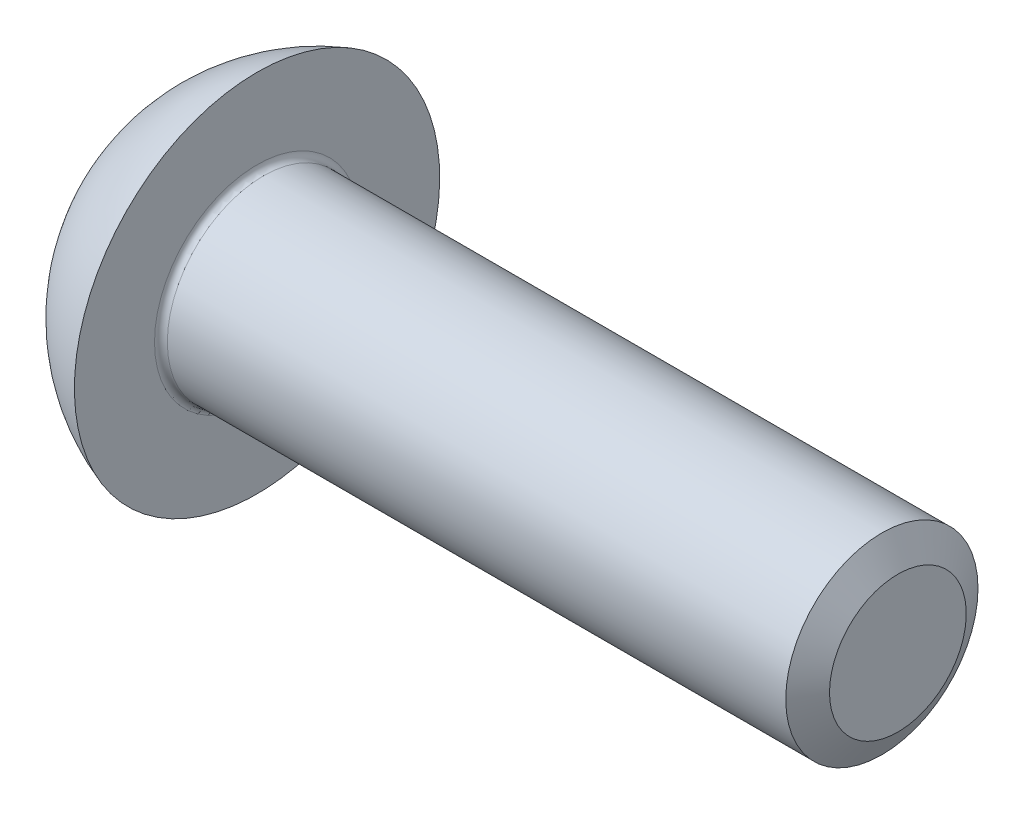
ISO-10303-21;
HEADER;
FILE_DESCRIPTION(('STEP AP214'),'2;1');
FILE_NAME('part.step','',(''),(''),'','','');
FILE_SCHEMA(('AUTOMOTIVE_DESIGN { 1 0 10303 214 1 1 1 1 }'));
ENDSEC;
DATA;
#1=APPLICATION_CONTEXT('core data for automotive mechanical design processes');
#2=APPLICATION_PROTOCOL_DEFINITION('international standard','automotive_design',2000,#1);
#3=PRODUCT_CONTEXT('',#1,'mechanical');
#4=PRODUCT('Part','Part','',(#3));
#5=PRODUCT_RELATED_PRODUCT_CATEGORY('part','',(#4));
#6=PRODUCT_DEFINITION_FORMATION('','',#4);
#7=PRODUCT_DEFINITION_CONTEXT('part definition',#1,'design');
#8=PRODUCT_DEFINITION('design','',#6,#7);
#9=PRODUCT_DEFINITION_SHAPE('','',#8);
#10=(LENGTH_UNIT() NAMED_UNIT(*) SI_UNIT(.MILLI.,.METRE.));
#11=(NAMED_UNIT(*) PLANE_ANGLE_UNIT() SI_UNIT($,.RADIAN.));
#12=(NAMED_UNIT(*) SI_UNIT($,.STERADIAN.) SOLID_ANGLE_UNIT());
#13=UNCERTAINTY_MEASURE_WITH_UNIT(LENGTH_MEASURE(1.E-05),#10,'distance_accuracy_value','');
#14=(GEOMETRIC_REPRESENTATION_CONTEXT(3) GLOBAL_UNCERTAINTY_ASSIGNED_CONTEXT((#13)) GLOBAL_UNIT_ASSIGNED_CONTEXT((#10,
#11,#12)) REPRESENTATION_CONTEXT('',''));
#15=CARTESIAN_POINT('',(0.,0.,0.));
#16=DIRECTION('',(0.,0.,1.));
#17=DIRECTION('',(1.,0.,0.));
#18=AXIS2_PLACEMENT_3D('',#15,#16,#17);
#19=CARTESIAN_POINT('',(-11.65,0.,0.));
#20=DIRECTION('',(-1.,0.,0.));
#21=DIRECTION('',(0.,0.,1.));
#22=AXIS2_PLACEMENT_3D('',#19,#20,#21);
#23=CYLINDRICAL_SURFACE('',#22,1.5);
#24=CARTESIAN_POINT('',(-9.9,0.,0.));
#25=DIRECTION('',(-1.,0.,0.));
#26=DIRECTION('',(0.,0.,1.));
#27=AXIS2_PLACEMENT_3D('',#24,#25,#26);
#28=CIRCLE('',#27,1.5);
#29=CARTESIAN_POINT('',(-9.9,0.,1.5));
#30=VERTEX_POINT('',#29);
#31=EDGE_CURVE('E259',#30,#30,#28,.T.);
#32=ORIENTED_EDGE('',*,*,#31,.F.);
#33=EDGE_LOOP('',(#32));
#34=FACE_BOUND('',#33,.T.);
#35=CARTESIAN_POINT('',(-0.25,0.,0.));
#36=DIRECTION('',(-1.,0.,0.));
#37=DIRECTION('',(0.,0.,1.));
#38=AXIS2_PLACEMENT_3D('',#35,#36,#37);
#39=CIRCLE('',#38,1.5);
#40=CARTESIAN_POINT('',(-0.25,0.,1.5));
#41=VERTEX_POINT('',#40);
#42=EDGE_CURVE('E446',#41,#41,#39,.T.);
#43=ORIENTED_EDGE('',*,*,#42,.T.);
#44=EDGE_LOOP('',(#43));
#45=FACE_BOUND('',#44,.T.);
#46=ADVANCED_FACE('F38',(#34,#45),#23,.T.);
#47=CARTESIAN_POINT('',(-11.65,0.,0.));
#48=DIRECTION('',(1.,0.,0.));
#49=DIRECTION('',(0.,0.,-1.));
#50=AXIS2_PLACEMENT_3D('',#47,#48,#49);
#51=PLANE('',#50);
#52=CARTESIAN_POINT('',(-11.65,0.,0.));
#53=DIRECTION('',(-1.,0.,0.));
#54=DIRECTION('',(0.,0.,1.));
#55=AXIS2_PLACEMENT_3D('',#52,#53,#54);
#56=CIRCLE('',#55,1.5);
#57=CARTESIAN_POINT('',(-11.65,1.5,0.));
#58=VERTEX_POINT('',#57);
#59=EDGE_CURVE('E251',#58,#58,#56,.T.);
#60=ORIENTED_EDGE('',*,*,#59,.T.);
#61=EDGE_LOOP('',(#60));
#62=FACE_BOUND('',#61,.T.);
#63=CARTESIAN_POINT('',(-11.65,0.,0.));
#64=DIRECTION('',(1.,0.,0.));
#65=DIRECTION('',(0.,0.,-1.));
#66=AXIS2_PLACEMENT_3D('',#63,#64,#65);
#67=CIRCLE('',#66,1.15470053837925);
#68=CARTESIAN_POINT('',(-11.65,-0.577350269189627,-1.));
#69=VERTEX_POINT('',#68);
#70=CARTESIAN_POINT('',(-11.65,-1.15470053837925,0.));
#71=VERTEX_POINT('',#70);
#72=EDGE_CURVE('E11',#69,#71,#67,.F.);
#73=ORIENTED_EDGE('',*,*,#72,.F.);
#74=CARTESIAN_POINT('',(-11.65,0.577350269189628,-1.));
#75=VERTEX_POINT('',#74);
#76=EDGE_CURVE('E42',#75,#69,#67,.F.);
#77=ORIENTED_EDGE('',*,*,#76,.F.);
#78=CARTESIAN_POINT('',(-11.65,1.15470053837925,0.));
#79=VERTEX_POINT('',#78);
#80=EDGE_CURVE('E111',#79,#75,#67,.F.);
#81=ORIENTED_EDGE('',*,*,#80,.F.);
#82=CARTESIAN_POINT('',(-11.65,0.,0.));
#83=DIRECTION('',(-1.,0.,0.));
#84=DIRECTION('',(0.,0.,1.));
#85=AXIS2_PLACEMENT_3D('',#82,#83,#84);
#86=CIRCLE('',#85,1.15470053837925);
#87=CARTESIAN_POINT('',(-11.65,0.577350269189629,1.));
#88=VERTEX_POINT('',#87);
#89=EDGE_CURVE('E131',#88,#79,#86,.T.);
#90=ORIENTED_EDGE('',*,*,#89,.F.);
#91=CARTESIAN_POINT('',(-11.65,-0.577350269189633,0.999999999999999));
#92=VERTEX_POINT('',#91);
#93=EDGE_CURVE('E325',#92,#88,#67,.F.);
#94=ORIENTED_EDGE('',*,*,#93,.F.);
#95=EDGE_CURVE('E47',#71,#92,#67,.F.);
#96=ORIENTED_EDGE('',*,*,#95,.F.);
#97=EDGE_LOOP('',(#73,#77,#81,#90,#94,#96));
#98=FACE_BOUND('',#97,.T.);
#99=ADVANCED_FACE('F40',(#62,#98),#51,.F.);
#100=CARTESIAN_POINT('',(-9.04545454545454,0.,0.));
#101=DIRECTION('',(-1.,0.,0.));
#102=DIRECTION('',(0.,1.,0.));
#103=AXIS2_PLACEMENT_3D('',#100,#101,#102);
#104=SPHERICAL_SURFACE('',#103,3.00560426949281);
#105=CARTESIAN_POINT('',(-10.,0.,0.));
#106=DIRECTION('',(-1.,0.,0.));
#107=DIRECTION('',(0.,0.,1.));
#108=AXIS2_PLACEMENT_3D('',#105,#106,#107);
#109=CIRCLE('',#108,2.85);
#110=CARTESIAN_POINT('',(-10.,2.85,0.));
#111=VERTEX_POINT('',#110);
#112=EDGE_CURVE('E254',#111,#111,#109,.T.);
#113=CARTESIAN_POINT('',(-11.65,1.5,0.));
#114=CARTESIAN_POINT('',(-11.6386705331495,1.51967216925548,0.));
#115=CARTESIAN_POINT('',(-11.6271181108235,1.53921593268644,0.));
#116=CARTESIAN_POINT('',(-11.6035734644196,1.57803672196104,0.));
#117=CARTESIAN_POINT('',(-11.5915812403415,1.59731374780469,0.));
#118=CARTESIAN_POINT('',(-11.5671630996322,1.6355911359664,0.));
#119=CARTESIAN_POINT('',(-11.554737183001,1.65459149828447,0.));
#120=CARTESIAN_POINT('',(-11.5294580495481,1.69230581219272,0.));
#121=CARTESIAN_POINT('',(-11.5166048327265,1.7110197637829,0.));
#122=CARTESIAN_POINT('',(-11.4904776944242,1.74815164624668,0.));
#123=CARTESIAN_POINT('',(-11.4772037729434,1.76656957712027,0.));
#124=CARTESIAN_POINT('',(-11.4502420411911,1.80309996277641,0.));
#125=CARTESIAN_POINT('',(-11.4365542309196,1.82121241755895,0.));
#126=CARTESIAN_POINT('',(-11.4087717487848,1.85712255178676,0.));
#127=CARTESIAN_POINT('',(-11.3946770769215,1.87492023123203,0.));
#128=CARTESIAN_POINT('',(-11.366088108,1.91019167733672,0.));
#129=CARTESIAN_POINT('',(-11.3515938109419,1.92766544399614,0.));
#130=CARTESIAN_POINT('',(-11.3222130331156,1.96228009332959,0.));
#131=CARTESIAN_POINT('',(-11.3073265523475,1.97942097600363,0.));
#132=CARTESIAN_POINT('',(-11.2771690499588,2.013361057086,0.));
#133=CARTESIAN_POINT('',(-11.2618980283382,2.03016025549433,0.));
#134=CARTESIAN_POINT('',(-11.2309792845233,2.06340834318511,0.));
#135=CARTESIAN_POINT('',(-11.2153315623289,2.07985723246756,0.));
#136=CARTESIAN_POINT('',(-11.1836674510477,2.11239625689921,0.));
#137=CARTESIAN_POINT('',(-11.1676510619609,2.12848639204841,0.));
#138=CARTESIAN_POINT('',(-11.1352578398529,2.16029964739355,0.));
#139=CARTESIAN_POINT('',(-11.1188810068317,2.17602276758948,0.));
#140=CARTESIAN_POINT('',(-11.0857753048683,2.2070939206369,0.));
#141=CARTESIAN_POINT('',(-11.069046435926,2.22244195348839,0.));
#142=CARTESIAN_POINT('',(-11.0352452508718,2.25275505202893,0.));
#143=CARTESIAN_POINT('',(-11.01817293476,2.26772011771799,0.));
#144=CARTESIAN_POINT('',(-10.9836936204474,2.29725959873448,0.));
#145=CARTESIAN_POINT('',(-10.9662866222466,2.3118340140619,0.));
#146=CARTESIAN_POINT('',(-10.9311468806653,2.34058471171934,0.));
#147=CARTESIAN_POINT('',(-10.9134141372848,2.35476099404935,0.));
#148=CARTESIAN_POINT('',(-10.8776320094939,2.38270814748122,0.));
#149=CARTESIAN_POINT('',(-10.8595826250834,2.39647901858308,0.));
#150=CARTESIAN_POINT('',(-10.8231764819488,2.42360827946968,0.));
#151=CARTESIAN_POINT('',(-10.8048197232246,2.43696666925442,0.));
#152=CARTESIAN_POINT('',(-10.7678082559874,2.46326410918943,0.));
#153=CARTESIAN_POINT('',(-10.7491535474743,2.4762031593397,0.));
#154=CARTESIAN_POINT('',(-10.7115557581542,2.50165527698115,0.));
#155=CARTESIAN_POINT('',(-10.6926126773472,2.51416834447232,0.));
#156=CARTESIAN_POINT('',(-10.6544478689872,2.53876207247436,0.));
#157=CARTESIAN_POINT('',(-10.6352261414343,2.55084273298524,0.));
#158=CARTESIAN_POINT('',(-10.5965139081898,2.57456544470666,0.));
#159=CARTESIAN_POINT('',(-10.5770234024984,2.5862074959172,0.));
#160=CARTESIAN_POINT('',(-10.5377836195783,2.60904701190566,0.));
#161=CARTESIAN_POINT('',(-10.5180343423497,2.62024447668356,0.));
#162=CARTESIAN_POINT('',(-10.4782871558097,2.6421890709225,0.));
#163=CARTESIAN_POINT('',(-10.4582892464984,2.65293620038353,0.));
#164=CARTESIAN_POINT('',(-10.4180550629064,2.67397460633529,0.));
#165=CARTESIAN_POINT('',(-10.3978187886257,2.68426588282604,0.));
#166=CARTESIAN_POINT('',(-10.3571182645539,2.70438729913089,0.));
#167=CARTESIAN_POINT('',(-10.3366540147628,2.714217438945,0.));
#168=CARTESIAN_POINT('',(-10.2955080462974,2.73341153528513,0.));
#169=CARTESIAN_POINT('',(-10.2748263276231,2.74277549181114,0.));
#170=CARTESIAN_POINT('',(-10.2332560392077,2.7610324130256,0.));
#171=CARTESIAN_POINT('',(-10.2123674694665,2.76992537771405,0.));
#172=CARTESIAN_POINT('',(-10.1703942046549,2.78723575329491,0.));
#173=CARTESIAN_POINT('',(-10.1493095095844,2.79565316418733,0.));
#174=CARTESIAN_POINT('',(-10.1069548141172,2.81200809653373,0.));
#175=CARTESIAN_POINT('',(-10.0856848137203,2.8199456179877,0.));
#176=CARTESIAN_POINT('',(-10.0429704467276,2.83533674876495,0.));
#177=CARTESIAN_POINT('',(-10.0215260801317,2.84279035808822,0.));
#178=CARTESIAN_POINT('',(-10.,2.85,0.));
#179=B_SPLINE_CURVE_WITH_KNOTS('',3,(#113,#114,#115,#116,#117,#118,#119,#120,#121,#122,#123,
#124,#125,#126,#127,#128,#129,#130,#131,#132,#133,#134,#135,#136,#137,#138,#139,#140,#141,#142,
#143,#144,#145,#146,#147,#148,#149,#150,#151,#152,#153,#154,#155,#156,#157,#158,#159,#160,#161,
#162,#163,#164,#165,#166,#167,#168,#169,#170,#171,#172,#173,#174,#175,#176,#177,#178),
.UNSPECIFIED.,.F.,.F.,(4,2,2,2,2,2,2,2,2,2,2,2,2,2,2,2,2,2,2,2,2,2,2,2,2,2,2,2,2,2,2,2,4),(0.,
0.0681025747754098,0.13620514955082,0.204307724326229,0.272410299101638,0.340512873877049,
0.408615448652459,0.476718023427868,0.544820598203277,0.612923172978688,0.681025747754097,
0.749128322529506,0.817230897304916,0.885333472080325,0.953436046855735,1.02153862163114,
1.08964119640655,1.15774377118196,1.22584634595737,1.29394892073278,1.36205149550819,
1.4301540702836,1.49825664505901,1.56635921983442,1.63446179460983,1.70256436938524,
1.77066694416065,1.83876951893606,1.90687209371147,1.97497466848688,2.04307724326229,
2.1111798180377,2.17928239281311),.UNSPECIFIED.);
#180=EDGE_CURVE('BSEAM240',#58,#111,#179,.T.);
#181=ORIENTED_EDGE('',*,*,#59,.F.);
#182=ORIENTED_EDGE('',*,*,#112,.T.);
#183=ORIENTED_EDGE('',*,*,#180,.T.);
#184=ORIENTED_EDGE('',*,*,#180,.F.);
#185=EDGE_LOOP('',(#181,#183,#182,#184));
#186=FACE_BOUND('',#185,.T.);
#187=ADVANCED_FACE('F240',(#186),#104,.T.);
#188=CARTESIAN_POINT('',(-10.,1.6,0.));
#189=DIRECTION('',(-1.,0.,0.));
#190=DIRECTION('',(0.,0.,1.));
#191=AXIS2_PLACEMENT_3D('',#188,#189,#190);
#192=PLANE('',#191);
#193=ORIENTED_EDGE('',*,*,#112,.F.);
#194=EDGE_LOOP('',(#193));
#195=FACE_BOUND('',#194,.T.);
#196=CARTESIAN_POINT('',(-10.,0.,0.));
#197=DIRECTION('',(-1.,0.,0.));
#198=DIRECTION('',(0.,0.,1.));
#199=AXIS2_PLACEMENT_3D('',#196,#197,#198);
#200=CIRCLE('',#199,1.6);
#201=CARTESIAN_POINT('',(-10.,0.,1.6));
#202=VERTEX_POINT('',#201);
#203=EDGE_CURVE('E255',#202,#202,#200,.T.);
#204=ORIENTED_EDGE('',*,*,#203,.T.);
#205=EDGE_LOOP('',(#204));
#206=FACE_BOUND('',#205,.T.);
#207=ADVANCED_FACE('F237',(#195,#206),#192,.F.);
#208=CARTESIAN_POINT('',(-9.9,0.,0.));
#209=DIRECTION('',(-1.,0.,0.));
#210=DIRECTION('',(0.,0.,1.));
#211=AXIS2_PLACEMENT_3D('',#208,#209,#210);
#212=TOROIDAL_SURFACE('',#211,1.6,0.100000000000001);
#213=ORIENTED_EDGE('',*,*,#203,.F.);
#214=EDGE_LOOP('',(#213));
#215=FACE_BOUND('',#214,.T.);
#216=ORIENTED_EDGE('',*,*,#31,.T.);
#217=EDGE_LOOP('',(#216));
#218=FACE_BOUND('',#217,.T.);
#219=ADVANCED_FACE('F234',(#215,#218),#212,.F.);
#220=CARTESIAN_POINT('',(-11.35,0.,0.));
#221=DIRECTION('',(-1.,0.,0.));
#222=DIRECTION('',(0.,0.,1.));
#223=AXIS2_PLACEMENT_3D('',#220,#221,#222);
#224=CONICAL_SURFACE('',#223,0.,1.31660847419538);
#225=CARTESIAN_POINT('',(-11.8201338061757,-1.50813004503231,-1.));
#226=CARTESIAN_POINT('',(-11.8103550434582,-1.46296169551439,-1.));
#227=CARTESIAN_POINT('',(-11.8007010634319,-1.41776633015548,-1.));
#228=CARTESIAN_POINT('',(-11.7817057249496,-1.32730802004726,-1.));
#229=CARTESIAN_POINT('',(-11.7723643798043,-1.28204507250605,-1.));
#230=CARTESIAN_POINT('',(-11.744887707109,-1.1460540932135,-1.));
#231=CARTESIAN_POINT('',(-11.727318593487,-1.05520983554783,-1.));
#232=CARTESIAN_POINT('',(-11.6946113120355,-0.873838301527072,-1.));
#233=CARTESIAN_POINT('',(-11.6794545669183,-0.783314439111172,-1.));
#234=CARTESIAN_POINT('',(-11.6526000869216,-0.60175454493786,-1.));
#235=CARTESIAN_POINT('',(-11.6409016960468,-0.510718613654572,-1.));
#236=CARTESIAN_POINT('',(-11.6224688104588,-0.32714728936339,-1.));
#237=CARTESIAN_POINT('',(-11.615787761882,-0.234606191530868,-1.));
#238=CARTESIAN_POINT('',(-11.6090368362792,-0.0493046546038917,-1.));
#239=CARTESIAN_POINT('',(-11.6089640024594,0.0434556678202335,-1.));
#240=CARTESIAN_POINT('',(-11.6154534933963,0.229083736297408,-1.));
#241=CARTESIAN_POINT('',(-11.6220414736928,0.321950510989412,-1.));
#242=CARTESIAN_POINT('',(-11.6404572139866,0.507192547661322,-1.));
#243=CARTESIAN_POINT('',(-11.6522884816114,0.599567438647767,-1.));
#244=CARTESIAN_POINT('',(-11.6798118313046,0.785811374344476,-1.));
#245=CARTESIAN_POINT('',(-11.6955836030667,0.879668210998828,-1.));
#246=CARTESIAN_POINT('',(-11.7295232966728,1.06695285350417,-1.));
#247=CARTESIAN_POINT('',(-11.7476915787193,1.16038059267178,-1.));
#248=CARTESIAN_POINT('',(-11.7855853163011,1.34694314919726,-1.));
#249=CARTESIAN_POINT('',(-11.8053112029702,1.44007787798179,-1.));
#250=CARTESIAN_POINT('',(-11.8457971322914,1.62612272763755,-1.));
#251=CARTESIAN_POINT('',(-11.866557196056,1.71903284388274,-1.));
#252=CARTESIAN_POINT('',(-11.9085485742601,1.90363742744432,-1.));
#253=CARTESIAN_POINT('',(-11.9297718689088,1.99533372655926,-1.));
#254=CARTESIAN_POINT('',(-11.9727143057913,2.17861191601367,-1.));
#255=CARTESIAN_POINT('',(-11.9944334585808,2.27019380387373,-1.));
#256=CARTESIAN_POINT('',(-12.0382042420233,2.45314970796374,-1.));
#257=CARTESIAN_POINT('',(-12.0602553943374,2.54452383886909,-1.));
#258=CARTESIAN_POINT('',(-12.1046332471854,2.72720190599484,-1.));
#259=CARTESIAN_POINT('',(-12.1269599382911,2.81850584450411,-1.));
#260=CARTESIAN_POINT('',(-12.1493826695211,2.90978592143881,-1.));
#261=B_SPLINE_CURVE_WITH_KNOTS('',3,(#225,#226,#227,#228,#229,#230,#231,#232,#233,#234,#235,
#236,#237,#238,#239,#240,#241,#242,#243,#244,#245,#246,#247,#248,#249,#250,#251,#252,#253,#254,
#255,#256,#257,#258,#259,#260),.UNSPECIFIED.,.F.,.F.,(4,2,2,2,2,2,2,2,2,2,2,2,2,2,2,2,2,4),(0.,
0.138643869889784,0.277293635233154,0.554857004517546,0.83016702278171,1.10542478551795,
1.38357462934898,1.66160001660697,1.94070037269333,2.21998772241581,2.50545939030146,
2.7909740144124,3.07656794584653,3.36216771000262,3.64452690710854,3.92689212062336,
4.20888343548739,4.49086512790399),.UNSPECIFIED.);
#262=EDGE_CURVE('E102',#69,#75,#261,.T.);
#263=ORIENTED_EDGE('',*,*,#262,.T.);
#264=ORIENTED_EDGE('',*,*,#76,.T.);
#265=EDGE_LOOP('',(#263,#264));
#266=FACE_BOUND('',#265,.T.);
#267=ADVANCED_FACE('F106',(#266),#224,.F.);
#268=CARTESIAN_POINT('',(-11.6500300044996,0.57723479913579,-1.0002));
#269=CARTESIAN_POINT('',(-11.6437929192042,0.601225021738601,-0.958647715567045));
#270=CARTESIAN_POINT('',(-11.6381313786167,0.625256195021442,-0.917024502475672));
#271=CARTESIAN_POINT('',(-11.6281854217223,0.673398386330441,-0.833639781140785));
#272=CARTESIAN_POINT('',(-11.6239015302713,0.697509431260086,-0.791878226299065));
#273=CARTESIAN_POINT('',(-11.6169589031667,0.745673772514857,-0.708455140132715));
#274=CARTESIAN_POINT('',(-11.6142923745456,0.769726780462719,-0.66679410829216));
#275=CARTESIAN_POINT('',(-11.6107168929941,0.817861664223351,-0.583422044002323));
#276=CARTESIAN_POINT('',(-11.6098076211353,0.841943534003896,-0.541711022001162));
#277=CARTESIAN_POINT('',(-11.6098076211353,0.890107273564986,-0.458288977998839));
#278=CARTESIAN_POINT('',(-11.6107168929941,0.914189143345531,-0.416577955997678));
#279=CARTESIAN_POINT('',(-11.6142923745456,0.962324027106163,-0.333205891707841));
#280=CARTESIAN_POINT('',(-11.6169589031667,0.986377035054025,-0.291544859867287));
#281=CARTESIAN_POINT('',(-11.6239015302713,1.0345413763088,-0.208121773700937));
#282=CARTESIAN_POINT('',(-11.6281854217223,1.05865242123844,-0.166360218859217));
#283=CARTESIAN_POINT('',(-11.6381313786167,1.10679461254744,-0.0829754975243297));
#284=CARTESIAN_POINT('',(-11.6437929192042,1.13082578583028,-0.0413522844329569));
#285=CARTESIAN_POINT('',(-11.6500300044996,1.15481600843309,0.000199999999999158));
#286=B_SPLINE_CURVE_WITH_KNOTS('',3,(#268,#269,#270,#271,#272,#273,#274,#275,#276,#277,#278,
#279,#280,#281,#282,#283,#284,#285),.UNSPECIFIED.,.F.,.F.,(4,2,2,2,2,2,2,2,4),(0.,
0.145159524820137,0.290374287087485,0.43488368212285,0.579366847367631,0.723850012612412,
0.868359407647777,1.01357416991512,1.15873369473526),.UNSPECIFIED.);
#287=EDGE_CURVE('E129',#75,#79,#286,.T.);
#288=ORIENTED_EDGE('',*,*,#287,.T.);
#289=ORIENTED_EDGE('',*,*,#80,.T.);
#290=EDGE_LOOP('',(#288,#289));
#291=FACE_BOUND('',#290,.T.);
#292=ADVANCED_FACE('F158',(#291),#224,.F.);
#293=CARTESIAN_POINT('',(-11.6500300044996,1.15481600843309,-0.000200000000000797));
#294=CARTESIAN_POINT('',(-11.6437929192042,1.13082578583028,0.0413522844329553));
#295=CARTESIAN_POINT('',(-11.6381313786167,1.10679461254744,0.0829754975243281));
#296=CARTESIAN_POINT('',(-11.6281854217223,1.05865242123844,0.166360218859215));
#297=CARTESIAN_POINT('',(-11.6239015302713,1.0345413763088,0.208121773700935));
#298=CARTESIAN_POINT('',(-11.6169589031667,0.986377035054025,0.291544859867285));
#299=CARTESIAN_POINT('',(-11.6142923745456,0.962324027106163,0.33320589170784));
#300=CARTESIAN_POINT('',(-11.6107168929941,0.914189143345531,0.416577955997676));
#301=CARTESIAN_POINT('',(-11.6098076211353,0.890107273564986,0.458288977998838));
#302=CARTESIAN_POINT('',(-11.6098076211353,0.841943534003896,0.541711022001161));
#303=CARTESIAN_POINT('',(-11.6107168929941,0.817861664223351,0.583422044002322));
#304=CARTESIAN_POINT('',(-11.6142923745456,0.769726780462719,0.666794108292159));
#305=CARTESIAN_POINT('',(-11.6169589031667,0.745673772514857,0.708455140132713));
#306=CARTESIAN_POINT('',(-11.6239015302713,0.697509431260086,0.791878226299063));
#307=CARTESIAN_POINT('',(-11.6281854217223,0.673398386330441,0.833639781140784));
#308=CARTESIAN_POINT('',(-11.6381313786167,0.625256195021442,0.91702450247567));
#309=CARTESIAN_POINT('',(-11.6437929192042,0.601225021738601,0.958647715567043));
#310=CARTESIAN_POINT('',(-11.6500300044996,0.57723479913579,1.0002));
#311=B_SPLINE_CURVE_WITH_KNOTS('',3,(#293,#294,#295,#296,#297,#298,#299,#300,#301,#302,#303,
#304,#305,#306,#307,#308,#309,#310),.UNSPECIFIED.,.F.,.F.,(4,2,2,2,2,2,2,2,4),(0.,
0.145159524820137,0.290374287087485,0.43488368212285,0.579366847367631,0.723850012612412,
0.868359407647777,1.01357416991512,1.15873369473526),.UNSPECIFIED.);
#312=EDGE_CURVE('E180',#79,#88,#311,.T.);
#313=ORIENTED_EDGE('',*,*,#312,.T.);
#314=ORIENTED_EDGE('',*,*,#89,.T.);
#315=EDGE_LOOP('',(#313,#314));
#316=FACE_BOUND('',#315,.T.);
#317=ADVANCED_FACE('F152',(#316),#224,.F.);
#318=CARTESIAN_POINT('',(-11.8201338061757,-1.5081300450323,0.999999999999999));
#319=CARTESIAN_POINT('',(-11.8103550434582,-1.46296169551439,0.999999999999999));
#320=CARTESIAN_POINT('',(-11.8007010634319,-1.41776633015547,0.999999999999999));
#321=CARTESIAN_POINT('',(-11.7817057249496,-1.32730802004725,0.999999999999999));
#322=CARTESIAN_POINT('',(-11.7723643798043,-1.28204507250605,0.999999999999999));
#323=CARTESIAN_POINT('',(-11.744887707109,-1.1460540932135,0.999999999999999));
#324=CARTESIAN_POINT('',(-11.727318593487,-1.05520983554783,0.999999999999999));
#325=CARTESIAN_POINT('',(-11.6946113120355,-0.87383830152707,0.999999999999999));
#326=CARTESIAN_POINT('',(-11.6794545669183,-0.783314439111171,0.999999999999999));
#327=CARTESIAN_POINT('',(-11.6526000869216,-0.60175454493786,0.999999999999999));
#328=CARTESIAN_POINT('',(-11.6409016960468,-0.510718613654572,0.999999999999999));
#329=CARTESIAN_POINT('',(-11.6224688104588,-0.327147289363391,0.999999999999999));
#330=CARTESIAN_POINT('',(-11.615787761882,-0.23460619153087,0.999999999999999));
#331=CARTESIAN_POINT('',(-11.6090368362792,-0.0493046546038946,0.999999999999999));
#332=CARTESIAN_POINT('',(-11.6089640024594,0.0434556678202299,0.999999999999999));
#333=CARTESIAN_POINT('',(-11.6154534933963,0.229083736297403,0.999999999999999));
#334=CARTESIAN_POINT('',(-11.6220414736928,0.321950510989406,0.999999999999999));
#335=CARTESIAN_POINT('',(-11.6404572139866,0.507192547661316,0.999999999999999));
#336=CARTESIAN_POINT('',(-11.6522884816114,0.59956743864776,0.999999999999999));
#337=CARTESIAN_POINT('',(-11.6798118313046,0.785811374344469,0.999999999999999));
#338=CARTESIAN_POINT('',(-11.6955836030667,0.87966821099882,0.999999999999999));
#339=CARTESIAN_POINT('',(-11.7295232966728,1.06695285350417,0.999999999999999));
#340=CARTESIAN_POINT('',(-11.7476915787193,1.16038059267177,0.999999999999999));
#341=CARTESIAN_POINT('',(-11.7855853163011,1.34694314919725,0.999999999999999));
#342=CARTESIAN_POINT('',(-11.8053112029702,1.44007787798179,0.999999999999999));
#343=CARTESIAN_POINT('',(-11.8457971322914,1.62612272763755,0.999999999999999));
#344=CARTESIAN_POINT('',(-11.866557196056,1.71903284388273,0.999999999999999));
#345=CARTESIAN_POINT('',(-11.9085485742601,1.90363742744431,0.999999999999999));
#346=CARTESIAN_POINT('',(-11.9297718689088,1.99533372655925,0.999999999999999));
#347=CARTESIAN_POINT('',(-11.9727143057913,2.17861191601366,0.999999999999999));
#348=CARTESIAN_POINT('',(-11.9944334585808,2.27019380387373,0.999999999999999));
#349=CARTESIAN_POINT('',(-12.0382042420233,2.45314970796373,0.999999999999999));
#350=CARTESIAN_POINT('',(-12.0602553943374,2.54452383886908,0.999999999999999));
#351=CARTESIAN_POINT('',(-12.1046332471854,2.72720190599484,0.999999999999999));
#352=CARTESIAN_POINT('',(-12.1269599382911,2.81850584450411,0.999999999999999));
#353=CARTESIAN_POINT('',(-12.1493826695211,2.9097859214388,0.999999999999999));
#354=B_SPLINE_CURVE_WITH_KNOTS('',3,(#318,#319,#320,#321,#322,#323,#324,#325,#326,#327,#328,
#329,#330,#331,#332,#333,#334,#335,#336,#337,#338,#339,#340,#341,#342,#343,#344,#345,#346,#347,
#348,#349,#350,#351,#352,#353),.UNSPECIFIED.,.F.,.F.,(4,2,2,2,2,2,2,2,2,2,2,2,2,2,2,2,2,4),(0.,
0.138643869889783,0.277293635233152,0.554857004517542,0.830167022781704,1.10542478551794,
1.38357462934898,1.66160001660695,1.94070037269331,2.21998772241579,2.50545939030145,
2.79097401441239,3.07656794584652,3.36216771000261,3.64452690710852,3.92689212062335,
4.20888343548738,4.49086512790398),.UNSPECIFIED.);
#355=EDGE_CURVE('E59',#88,#92,#354,.F.);
#356=ORIENTED_EDGE('',*,*,#355,.T.);
#357=ORIENTED_EDGE('',*,*,#93,.T.);
#358=EDGE_LOOP('',(#356,#357));
#359=FACE_BOUND('',#358,.T.);
#360=ADVANCED_FACE('F157',(#359),#224,.F.);
#361=CARTESIAN_POINT('',(-11.6500300044996,-0.577234799135789,1.0002));
#362=CARTESIAN_POINT('',(-11.6437929192042,-0.6012250217386,0.958647715567043));
#363=CARTESIAN_POINT('',(-11.6381313786167,-0.625256195021441,0.91702450247567));
#364=CARTESIAN_POINT('',(-11.6281854217223,-0.67339838633044,0.833639781140783));
#365=CARTESIAN_POINT('',(-11.6239015302713,-0.697509431260085,0.791878226299063));
#366=CARTESIAN_POINT('',(-11.6169589031667,-0.745673772514856,0.708455140132713));
#367=CARTESIAN_POINT('',(-11.6142923745456,-0.769726780462718,0.666794108292158));
#368=CARTESIAN_POINT('',(-11.6107168929941,-0.81786166422335,0.583422044002322));
#369=CARTESIAN_POINT('',(-11.6098076211353,-0.841943534003895,0.54171102200116));
#370=CARTESIAN_POINT('',(-11.6098076211353,-0.890107273564985,0.458288977998838));
#371=CARTESIAN_POINT('',(-11.6107168929941,-0.914189143345529,0.416577955997676));
#372=CARTESIAN_POINT('',(-11.6142923745456,-0.962324027106161,0.33320589170784));
#373=CARTESIAN_POINT('',(-11.6169589031667,-0.986377035054023,0.291544859867285));
#374=CARTESIAN_POINT('',(-11.6239015302713,-1.03454137630879,0.208121773700935));
#375=CARTESIAN_POINT('',(-11.6281854217223,-1.05865242123844,0.166360218859215));
#376=CARTESIAN_POINT('',(-11.6381313786167,-1.10679461254744,0.082975497524328));
#377=CARTESIAN_POINT('',(-11.6437929192042,-1.13082578583028,0.0413522844329552));
#378=CARTESIAN_POINT('',(-11.6500300044996,-1.15481600843309,-0.000200000000000961));
#379=B_SPLINE_CURVE_WITH_KNOTS('',3,(#361,#362,#363,#364,#365,#366,#367,#368,#369,#370,#371,
#372,#373,#374,#375,#376,#377,#378),.UNSPECIFIED.,.F.,.F.,(4,2,2,2,2,2,2,2,4),(0.,
0.145159524820138,0.290374287087485,0.43488368212285,0.579366847367631,0.723850012612412,
0.868359407647777,1.01357416991512,1.15873369473526),.UNSPECIFIED.);
#380=EDGE_CURVE('E53',#92,#71,#379,.T.);
#381=ORIENTED_EDGE('',*,*,#380,.T.);
#382=ORIENTED_EDGE('',*,*,#95,.T.);
#383=EDGE_LOOP('',(#381,#382));
#384=FACE_BOUND('',#383,.T.);
#385=ADVANCED_FACE('F311',(#384),#224,.F.);
#386=CARTESIAN_POINT('',(-11.6500300044996,-1.15481600843309,0.0001999999999991));
#387=CARTESIAN_POINT('',(-11.6437929192042,-1.13082578583028,-0.0413522844329571));
#388=CARTESIAN_POINT('',(-11.6381313786167,-1.10679461254744,-0.0829754975243299));
#389=CARTESIAN_POINT('',(-11.6281854217223,-1.05865242123844,-0.166360218859217));
#390=CARTESIAN_POINT('',(-11.6239015302713,-1.03454137630879,-0.208121773700937));
#391=CARTESIAN_POINT('',(-11.6169589031667,-0.986377035054023,-0.291544859867287));
#392=CARTESIAN_POINT('',(-11.6142923745456,-0.962324027106161,-0.333205891707842));
#393=CARTESIAN_POINT('',(-11.6107168929941,-0.914189143345529,-0.416577955997678));
#394=CARTESIAN_POINT('',(-11.6098076211353,-0.890107273564984,-0.45828897799884));
#395=CARTESIAN_POINT('',(-11.6098076211353,-0.841943534003894,-0.541711022001162));
#396=CARTESIAN_POINT('',(-11.6107168929941,-0.817861664223349,-0.583422044002324));
#397=CARTESIAN_POINT('',(-11.6142923745456,-0.769726780462718,-0.66679410829216));
#398=CARTESIAN_POINT('',(-11.6169589031667,-0.745673772514856,-0.708455140132715));
#399=CARTESIAN_POINT('',(-11.6239015302713,-0.697509431260084,-0.791878226299065));
#400=CARTESIAN_POINT('',(-11.6281854217223,-0.67339838633044,-0.833639781140785));
#401=CARTESIAN_POINT('',(-11.6381313786167,-0.625256195021441,-0.917024502475672));
#402=CARTESIAN_POINT('',(-11.6437929192042,-0.601225021738599,-0.958647715567045));
#403=CARTESIAN_POINT('',(-11.6500300044996,-0.577234799135788,-1.0002));
#404=B_SPLINE_CURVE_WITH_KNOTS('',3,(#386,#387,#388,#389,#390,#391,#392,#393,#394,#395,#396,
#397,#398,#399,#400,#401,#402,#403),.UNSPECIFIED.,.F.,.F.,(4,2,2,2,2,2,2,2,4),(0.,
0.145159524820138,0.290374287087485,0.43488368212285,0.579366847367631,0.723850012612412,
0.868359407647777,1.01357416991512,1.15873369473526),.UNSPECIFIED.);
#405=EDGE_CURVE('E94',#71,#69,#404,.T.);
#406=ORIENTED_EDGE('',*,*,#405,.T.);
#407=ORIENTED_EDGE('',*,*,#72,.T.);
#408=EDGE_LOOP('',(#406,#407));
#409=FACE_BOUND('',#408,.T.);
#410=ADVANCED_FACE('F96',(#409),#224,.F.);
#411=CARTESIAN_POINT('',(-10.61,0.,0.));
#412=DIRECTION('',(-1.,0.,0.));
#413=DIRECTION('',(0.,0.,1.));
#414=AXIS2_PLACEMENT_3D('',#411,#412,#413);
#415=CONICAL_SURFACE('',#414,1.15470053837925,1.08478502970568);
#416=CARTESIAN_POINT('',(-10.,0.,0.));
#417=VERTEX_POINT('',#416);
#418=VERTEX_LOOP('',#417);
#419=FACE_BOUND('',#418,.T.);
#420=CARTESIAN_POINT('',(-10.9533777683403,-1.50230992873526,0.999999999999999));
#421=CARTESIAN_POINT('',(-10.9340444769777,-1.45833854185076,0.999999999999999));
#422=CARTESIAN_POINT('',(-10.9149232467738,-1.41427434344668,0.999999999999999));
#423=CARTESIAN_POINT('',(-10.8772163059513,-1.32590919920826,0.999999999999999));
#424=CARTESIAN_POINT('',(-10.8586306830292,-1.28160821599644,0.999999999999999));
#425=CARTESIAN_POINT('',(-10.8036681478386,-1.14784319726152,0.999999999999999));
#426=CARTESIAN_POINT('',(-10.7682844804861,-1.05796321251933,0.999999999999999));
#427=CARTESIAN_POINT('',(-10.7014887265583,-0.876123438160723,0.999999999999999));
#428=CARTESIAN_POINT('',(-10.670100993813,-0.784154578942252,0.999999999999999));
#429=CARTESIAN_POINT('',(-10.6142698926597,-0.598229842457834,0.999999999999999));
#430=CARTESIAN_POINT('',(-10.5898112637181,-0.504278829186389,0.999999999999999));
#431=CARTESIAN_POINT('',(-10.561284211292,-0.361662527207037,0.999999999999999));
#432=CARTESIAN_POINT('',(-10.5531336537352,-0.313821896859327,0.999999999999999));
#433=CARTESIAN_POINT('',(-10.5400901383612,-0.217683951682428,0.999999999999999));
#434=CARTESIAN_POINT('',(-10.5351973854909,-0.169386608315469,0.999999999999999));
#435=CARTESIAN_POINT('',(-10.5290689217004,-0.0727543492205679,0.999999999999999));
#436=CARTESIAN_POINT('',(-10.5278181907857,-0.0244204124532974,0.999999999999999));
#437=CARTESIAN_POINT('',(-10.5290340461929,0.0721832270827322,0.999999999999999));
#438=CARTESIAN_POINT('',(-10.5314996115354,0.120452943848545,0.999999999999999));
#439=CARTESIAN_POINT('',(-10.5426858199704,0.247728096968901,0.999999999999999));
#440=CARTESIAN_POINT('',(-10.554415626327,0.326472817075772,0.999999999999999));
#441=CARTESIAN_POINT('',(-10.5853155073205,0.482611029430835,0.999999999999999));
#442=CARTESIAN_POINT('',(-10.6045054158237,0.560000340052676,0.999999999999999));
#443=CARTESIAN_POINT('',(-10.6484420949321,0.714868516061648,0.999999999999999));
#444=CARTESIAN_POINT('',(-10.6732951431871,0.792316418029711,0.999999999999999));
#445=CARTESIAN_POINT('',(-10.7131493499715,0.907307575681686,0.999999999999999));
#446=CARTESIAN_POINT('',(-10.7268173023165,0.94532619183517,0.999999999999999));
#447=CARTESIAN_POINT('',(-10.7548765004687,1.02108213718649,0.999999999999999));
#448=CARTESIAN_POINT('',(-10.7692675113704,1.05881955322303,0.999999999999999));
#449=CARTESIAN_POINT('',(-10.783948942311,1.0964438770373,0.999999999999999));
#450=B_SPLINE_CURVE_WITH_KNOTS('',3,(#420,#421,#422,#423,#424,#425,#426,#427,#428,#429,#430,
#431,#432,#433,#434,#435,#436,#437,#438,#439,#440,#441,#442,#443,#444,#445,#446,#447,#448,#449),
.UNSPECIFIED.,.F.,.F.,(4,2,2,2,2,2,2,2,2,2,2,2,2,2,4),(0.,0.144099688332552,0.288222837954159,
0.577934102924425,0.869334177214382,1.16008739746132,1.30558498590577,1.45109172666276,
1.59599752995898,1.74086353048646,1.97918576956974,2.21814600788027,2.46202630637786,
2.58322416173437,2.70438289404452),.UNSPECIFIED.);
#451=CARTESIAN_POINT('',(-10.61,-0.577350269189627,0.999999999999999));
#452=VERTEX_POINT('',#451);
#453=CARTESIAN_POINT('',(-10.61,0.577350269189628,0.999999999999999));
#454=VERTEX_POINT('',#453);
#455=EDGE_CURVE('E196',#452,#454,#450,.T.);
#456=ORIENTED_EDGE('',*,*,#455,.T.);
#457=CARTESIAN_POINT('',(-10.6100610091491,0.57723479913579,1.0002));
#458=CARTESIAN_POINT('',(-10.5967471675624,0.602421402936659,0.956575522546786));
#459=CARTESIAN_POINT('',(-10.5846484366666,0.627789970277027,0.912635874998037));
#460=CARTESIAN_POINT('',(-10.5635159299897,0.678892423428093,0.824123829748983));
#461=CARTESIAN_POINT('',(-10.5544881451853,0.704626922430508,0.77955036996947));
#462=CARTESIAN_POINT('',(-10.5403368995943,0.755829480104159,0.69086493860123));
#463=CARTESIAN_POINT('',(-10.5351365451759,0.78129204013318,0.646762490940193));
#464=CARTESIAN_POINT('',(-10.5287989102245,0.832321934515702,0.558376121164792));
#465=CARTESIAN_POINT('',(-10.527657647587,0.857889141534311,0.514092419600929));
#466=CARTESIAN_POINT('',(-10.5294293203474,0.906140287040708,0.430518984060451));
#467=CARTESIAN_POINT('',(-10.5319054116845,0.928828599718462,0.391221673764572));
#468=CARTESIAN_POINT('',(-10.5399567288674,0.974082594298357,0.312839455906747));
#469=CARTESIAN_POINT('',(-10.5455343304689,0.996648168786446,0.273754734391396));
#470=CARTESIAN_POINT('',(-10.5595556697914,1.04198502975731,0.195228987734173));
#471=CARTESIAN_POINT('',(-10.5680513970794,1.06475218926301,0.155795110726276));
#472=CARTESIAN_POINT('',(-10.5874031221558,1.1099976059254,0.0774277502573917));
#473=CARTESIAN_POINT('',(-10.5982552609432,1.13247627253034,0.0384935576112345));
#474=CARTESIAN_POINT('',(-10.6100610091491,1.15481600843309,-0.000200000000000715));
#475=B_SPLINE_CURVE_WITH_KNOTS('',3,(#457,#458,#459,#460,#461,#462,#463,#464,#465,#466,#467,
#468,#469,#470,#471,#472,#473,#474),.UNSPECIFIED.,.F.,.F.,(4,2,2,2,2,2,2,2,4),(0.,
0.156356652206859,0.313016607627113,0.466436255933325,0.619705352863253,0.755925705289371,
0.892250546480128,1.03114227500706,1.16980823889878),.UNSPECIFIED.);
#476=CARTESIAN_POINT('',(-10.61,1.15470053837925,0.));
#477=VERTEX_POINT('',#476);
#478=EDGE_CURVE('E204',#454,#477,#475,.T.);
#479=ORIENTED_EDGE('',*,*,#478,.T.);
#480=CARTESIAN_POINT('',(-10.6100610091491,1.15481600843309,0.000199999999999174));
#481=CARTESIAN_POINT('',(-10.5967471675624,1.12962940463222,-0.0434244774532135));
#482=CARTESIAN_POINT('',(-10.5846484366666,1.10426083729186,-0.0873641250019624));
#483=CARTESIAN_POINT('',(-10.5635159299897,1.05315838414079,-0.175876170251017));
#484=CARTESIAN_POINT('',(-10.5544881451853,1.02742388513837,-0.220449630030531));
#485=CARTESIAN_POINT('',(-10.5403368995943,0.976221327464723,-0.30913506139877));
#486=CARTESIAN_POINT('',(-10.5351365451759,0.950758767435701,-0.353237509059808));
#487=CARTESIAN_POINT('',(-10.5287989102245,0.89972887305318,-0.441623878835209));
#488=CARTESIAN_POINT('',(-10.527657647587,0.87416166603457,-0.485907580399073));
#489=CARTESIAN_POINT('',(-10.5294293203474,0.825910520528174,-0.56948101593955));
#490=CARTESIAN_POINT('',(-10.5319054116845,0.80322220785042,-0.608778326235429));
#491=CARTESIAN_POINT('',(-10.5399567288674,0.757968213270525,-0.687160544093253));
#492=CARTESIAN_POINT('',(-10.5455343304689,0.735402638782435,-0.726245265608604));
#493=CARTESIAN_POINT('',(-10.5595556697914,0.690065777811571,-0.804771012265827));
#494=CARTESIAN_POINT('',(-10.5680513970794,0.667298618305871,-0.844204889273724));
#495=CARTESIAN_POINT('',(-10.5874031221558,0.622053201643481,-0.922572249742609));
#496=CARTESIAN_POINT('',(-10.5982552609432,0.599574535038541,-0.961506442388766));
#497=CARTESIAN_POINT('',(-10.6100610091491,0.57723479913579,-1.0002));
#498=B_SPLINE_CURVE_WITH_KNOTS('',3,(#480,#481,#482,#483,#484,#485,#486,#487,#488,#489,#490,
#491,#492,#493,#494,#495,#496,#497),.UNSPECIFIED.,.F.,.F.,(4,2,2,2,2,2,2,2,4),(0.,
0.156356652206859,0.313016607627114,0.466436255933326,0.619705352863255,0.755925705289373,
0.892250546480129,1.03114227500706,1.16980823889878),.UNSPECIFIED.);
#499=CARTESIAN_POINT('',(-10.61,0.577350269189628,-1.));
#500=VERTEX_POINT('',#499);
#501=EDGE_CURVE('E112',#477,#500,#498,.T.);
#502=ORIENTED_EDGE('',*,*,#501,.T.);
#503=CARTESIAN_POINT('',(-10.9533777683403,-1.50230992873526,-1.));
#504=CARTESIAN_POINT('',(-10.9340444769777,-1.45833854185076,-1.));
#505=CARTESIAN_POINT('',(-10.9149232467738,-1.41427434344668,-1.));
#506=CARTESIAN_POINT('',(-10.8772163059513,-1.32590919920826,-1.));
#507=CARTESIAN_POINT('',(-10.8586306830292,-1.28160821599644,-1.));
#508=CARTESIAN_POINT('',(-10.8036681478386,-1.14784319726152,-1.));
#509=CARTESIAN_POINT('',(-10.7682844804861,-1.05796321251933,-1.));
#510=CARTESIAN_POINT('',(-10.7014887265583,-0.876123438160721,-1.));
#511=CARTESIAN_POINT('',(-10.670100993813,-0.78415457894225,-1.));
#512=CARTESIAN_POINT('',(-10.6142698926597,-0.598229842457832,-1.));
#513=CARTESIAN_POINT('',(-10.5898112637181,-0.504278829186387,-1.));
#514=CARTESIAN_POINT('',(-10.561284211292,-0.361662527207035,-1.));
#515=CARTESIAN_POINT('',(-10.5531336537352,-0.313821896859326,-1.));
#516=CARTESIAN_POINT('',(-10.5400901383612,-0.217683951682427,-1.));
#517=CARTESIAN_POINT('',(-10.5351973854909,-0.169386608315468,-1.));
#518=CARTESIAN_POINT('',(-10.5290689217004,-0.0727543492205669,-1.));
#519=CARTESIAN_POINT('',(-10.5278181907857,-0.0244204124532966,-1.));
#520=CARTESIAN_POINT('',(-10.5290340461929,0.0721832270827328,-1.));
#521=CARTESIAN_POINT('',(-10.5314996115354,0.120452943848545,-1.));
#522=CARTESIAN_POINT('',(-10.5426858199704,0.247728096968902,-1.));
#523=CARTESIAN_POINT('',(-10.554415626327,0.326472817075773,-1.));
#524=CARTESIAN_POINT('',(-10.5853155073205,0.482611029430836,-1.));
#525=CARTESIAN_POINT('',(-10.6045054158237,0.560000340052678,-1.));
#526=CARTESIAN_POINT('',(-10.6484420949321,0.71486851606165,-1.));
#527=CARTESIAN_POINT('',(-10.6732951431871,0.792316418029714,-1.));
#528=CARTESIAN_POINT('',(-10.7131493499715,0.907307575681688,-1.));
#529=CARTESIAN_POINT('',(-10.7268173023165,0.945326191835172,-1.));
#530=CARTESIAN_POINT('',(-10.7548765004687,1.02108213718649,-1.));
#531=CARTESIAN_POINT('',(-10.7692675113704,1.05881955322303,-1.));
#532=CARTESIAN_POINT('',(-10.783948942311,1.0964438770373,-1.));
#533=B_SPLINE_CURVE_WITH_KNOTS('',3,(#503,#504,#505,#506,#507,#508,#509,#510,#511,#512,#513,
#514,#515,#516,#517,#518,#519,#520,#521,#522,#523,#524,#525,#526,#527,#528,#529,#530,#531,#532),
.UNSPECIFIED.,.F.,.F.,(4,2,2,2,2,2,2,2,2,2,2,2,2,2,4),(0.,0.144099688332552,0.288222837954158,
0.577934102924427,0.869334177214384,1.16008739746132,1.30558498590577,1.45109172666276,
1.59599752995898,1.74086353048646,1.97918576956974,2.21814600788027,2.46202630637786,
2.58322416173438,2.70438289404452),.UNSPECIFIED.);
#534=CARTESIAN_POINT('',(-10.61,-0.577350269189626,-1.));
#535=VERTEX_POINT('',#534);
#536=EDGE_CURVE('E268',#500,#535,#533,.F.);
#537=ORIENTED_EDGE('',*,*,#536,.T.);
#538=CARTESIAN_POINT('',(-10.6100610091491,-0.577234799135788,-1.0002));
#539=CARTESIAN_POINT('',(-10.5967471675624,-0.602421402936657,-0.956575522546788));
#540=CARTESIAN_POINT('',(-10.5846484366666,-0.627789970277025,-0.912635874998039));
#541=CARTESIAN_POINT('',(-10.5635159299897,-0.678892423428091,-0.824123829748985));
#542=CARTESIAN_POINT('',(-10.5544881451853,-0.704626922430506,-0.779550369969471));
#543=CARTESIAN_POINT('',(-10.5403368995943,-0.755829480104157,-0.690864938601232));
#544=CARTESIAN_POINT('',(-10.5351365451759,-0.781292040133179,-0.646762490940194));
#545=CARTESIAN_POINT('',(-10.5287989102245,-0.8323219345157,-0.558376121164794));
#546=CARTESIAN_POINT('',(-10.527657647587,-0.85788914153431,-0.51409241960093));
#547=CARTESIAN_POINT('',(-10.5294293203474,-0.906140287040706,-0.430518984060452));
#548=CARTESIAN_POINT('',(-10.5319054116845,-0.92882859971846,-0.391221673764574));
#549=CARTESIAN_POINT('',(-10.5399567288674,-0.974082594298355,-0.312839455906749));
#550=CARTESIAN_POINT('',(-10.5455343304689,-0.996648168786445,-0.273754734391398));
#551=CARTESIAN_POINT('',(-10.5595556697914,-1.04198502975731,-0.195228987734175));
#552=CARTESIAN_POINT('',(-10.5680513970794,-1.06475218926301,-0.155795110726278));
#553=CARTESIAN_POINT('',(-10.5874031221558,-1.1099976059254,-0.077427750257394));
#554=CARTESIAN_POINT('',(-10.5982552609432,-1.13247627253034,-0.0384935576112367));
#555=CARTESIAN_POINT('',(-10.6100610091491,-1.15481600843309,0.000199999999998932));
#556=B_SPLINE_CURVE_WITH_KNOTS('',3,(#538,#539,#540,#541,#542,#543,#544,#545,#546,#547,#548,
#549,#550,#551,#552,#553,#554,#555),.UNSPECIFIED.,.F.,.F.,(4,2,2,2,2,2,2,2,4),(0.,
0.156356652206859,0.313016607627113,0.466436255933325,0.619705352863253,0.755925705289371,
0.892250546480127,1.03114227500706,1.16980823889878),.UNSPECIFIED.);
#557=CARTESIAN_POINT('',(-10.61,-1.15470053837925,0.));
#558=VERTEX_POINT('',#557);
#559=EDGE_CURVE('E119',#535,#558,#556,.T.);
#560=ORIENTED_EDGE('',*,*,#559,.T.);
#561=CARTESIAN_POINT('',(-10.6100610091491,-1.15481600843309,-0.000200000000000695));
#562=CARTESIAN_POINT('',(-10.5967471675624,-1.12962940463222,0.0434244774532119));
#563=CARTESIAN_POINT('',(-10.5846484366666,-1.10426083729185,0.0873641250019606));
#564=CARTESIAN_POINT('',(-10.5635159299897,-1.05315838414079,0.175876170251015));
#565=CARTESIAN_POINT('',(-10.5544881451853,-1.02742388513837,0.220449630030528));
#566=CARTESIAN_POINT('',(-10.5403368995943,-0.976221327464722,0.309135061398768));
#567=CARTESIAN_POINT('',(-10.5351365451759,-0.9507587674357,0.353237509059805));
#568=CARTESIAN_POINT('',(-10.5287989102245,-0.899728873053179,0.441623878835206));
#569=CARTESIAN_POINT('',(-10.527657647587,-0.874161666034569,0.48590758039907));
#570=CARTESIAN_POINT('',(-10.5294293203474,-0.825910520528173,0.569481015939547));
#571=CARTESIAN_POINT('',(-10.5319054116845,-0.803222207850419,0.608778326235426));
#572=CARTESIAN_POINT('',(-10.5399567288674,-0.757968213270524,0.687160544093251));
#573=CARTESIAN_POINT('',(-10.5455343304689,-0.735402638782435,0.726245265608602));
#574=CARTESIAN_POINT('',(-10.5595556697914,-0.69006577781157,0.804771012265825));
#575=CARTESIAN_POINT('',(-10.5680513970794,-0.667298618305871,0.844204889273722));
#576=CARTESIAN_POINT('',(-10.5874031221558,-0.62205320164348,0.922572249742606));
#577=CARTESIAN_POINT('',(-10.5982552609432,-0.59957453503854,0.961506442388763));
#578=CARTESIAN_POINT('',(-10.6100610091491,-0.577234799135789,1.0002));
#579=B_SPLINE_CURVE_WITH_KNOTS('',3,(#561,#562,#563,#564,#565,#566,#567,#568,#569,#570,#571,
#572,#573,#574,#575,#576,#577,#578),.UNSPECIFIED.,.F.,.F.,(4,2,2,2,2,2,2,2,4),(0.,
0.156356652206859,0.313016607627113,0.466436255933325,0.619705352863253,0.755925705289371,
0.892250546480127,1.03114227500706,1.16980823889878),.UNSPECIFIED.);
#580=EDGE_CURVE('E205',#558,#452,#579,.T.);
#581=ORIENTED_EDGE('',*,*,#580,.T.);
#582=EDGE_LOOP('',(#456,#479,#502,#537,#560,#581));
#583=FACE_BOUND('',#582,.T.);
#584=ADVANCED_FACE('F161',(#419,#583),#415,.F.);
#585=CARTESIAN_POINT('',(-10.,1.15470053837925,0.));
#586=DIRECTION('',(0.,0.866025403784438,-0.5));
#587=DIRECTION('',(0.,0.5,0.866025403784438));
#588=AXIS2_PLACEMENT_3D('',#585,#586,#587);
#589=PLANE('',#588);
#590=ORIENTED_EDGE('',*,*,#287,.F.);
#591=DIRECTION('',(-1.,0.,0.));
#592=VECTOR('',#591,1.);
#593=CARTESIAN_POINT('',(-10.,0.577350269189628,-1.));
#594=LINE('',#593,#592);
#595=EDGE_CURVE('E124',#500,#75,#594,.T.);
#596=ORIENTED_EDGE('',*,*,#595,.F.);
#597=ORIENTED_EDGE('',*,*,#501,.F.);
#598=DIRECTION('',(-1.,0.,0.));
#599=VECTOR('',#598,1.);
#600=CARTESIAN_POINT('',(-10.,1.15470053837925,0.));
#601=LINE('',#600,#599);
#602=EDGE_CURVE('E217',#477,#79,#601,.T.);
#603=ORIENTED_EDGE('',*,*,#602,.T.);
#604=EDGE_LOOP('',(#590,#596,#597,#603));
#605=FACE_BOUND('',#604,.T.);
#606=ADVANCED_FACE('F224',(#605),#589,.F.);
#607=CARTESIAN_POINT('',(-10.,0.577350269189628,-1.));
#608=DIRECTION('',(0.,0.,-1.));
#609=DIRECTION('',(-1.,0.,0.));
#610=AXIS2_PLACEMENT_3D('',#607,#608,#609);
#611=PLANE('',#610);
#612=ORIENTED_EDGE('',*,*,#262,.F.);
#613=DIRECTION('',(-1.,0.,0.));
#614=VECTOR('',#613,1.);
#615=CARTESIAN_POINT('',(-10.,-0.577350269189626,-1.));
#616=LINE('',#615,#614);
#617=EDGE_CURVE('E116',#535,#69,#616,.T.);
#618=ORIENTED_EDGE('',*,*,#617,.F.);
#619=ORIENTED_EDGE('',*,*,#536,.F.);
#620=ORIENTED_EDGE('',*,*,#595,.T.);
#621=EDGE_LOOP('',(#612,#618,#619,#620));
#622=FACE_BOUND('',#621,.T.);
#623=ADVANCED_FACE('F127',(#622),#611,.F.);
#624=CARTESIAN_POINT('',(-10.,-0.577350269189626,-1.));
#625=DIRECTION('',(0.,-0.866025403784438,-0.5));
#626=DIRECTION('',(0.,0.5,-0.866025403784438));
#627=AXIS2_PLACEMENT_3D('',#624,#625,#626);
#628=PLANE('',#627);
#629=ORIENTED_EDGE('',*,*,#405,.F.);
#630=DIRECTION('',(-1.,0.,0.));
#631=VECTOR('',#630,1.);
#632=CARTESIAN_POINT('',(-10.,-1.15470053837925,0.));
#633=LINE('',#632,#631);
#634=EDGE_CURVE('E123',#558,#71,#633,.T.);
#635=ORIENTED_EDGE('',*,*,#634,.F.);
#636=ORIENTED_EDGE('',*,*,#559,.F.);
#637=ORIENTED_EDGE('',*,*,#617,.T.);
#638=EDGE_LOOP('',(#629,#635,#636,#637));
#639=FACE_BOUND('',#638,.T.);
#640=ADVANCED_FACE('F117',(#639),#628,.F.);
#641=CARTESIAN_POINT('',(-10.,-1.15470053837925,0.));
#642=DIRECTION('',(0.,-0.866025403784439,0.5));
#643=DIRECTION('',(0.,-0.5,-0.866025403784439));
#644=AXIS2_PLACEMENT_3D('',#641,#642,#643);
#645=PLANE('',#644);
#646=ORIENTED_EDGE('',*,*,#380,.F.);
#647=DIRECTION('',(-1.,0.,0.));
#648=VECTOR('',#647,1.);
#649=CARTESIAN_POINT('',(-10.,-0.577350269189627,0.999999999999999));
#650=LINE('',#649,#648);
#651=EDGE_CURVE('E280',#452,#92,#650,.T.);
#652=ORIENTED_EDGE('',*,*,#651,.F.);
#653=ORIENTED_EDGE('',*,*,#580,.F.);
#654=ORIENTED_EDGE('',*,*,#634,.T.);
#655=EDGE_LOOP('',(#646,#652,#653,#654));
#656=FACE_BOUND('',#655,.T.);
#657=ADVANCED_FACE('F191',(#656),#645,.F.);
#658=CARTESIAN_POINT('',(-10.,-0.577350269189627,0.999999999999999));
#659=DIRECTION('',(0.,0.,1.));
#660=DIRECTION('',(1.,0.,0.));
#661=AXIS2_PLACEMENT_3D('',#658,#659,#660);
#662=PLANE('',#661);
#663=ORIENTED_EDGE('',*,*,#355,.F.);
#664=DIRECTION('',(-1.,0.,0.));
#665=VECTOR('',#664,1.);
#666=CARTESIAN_POINT('',(-10.,0.577350269189628,0.999999999999999));
#667=LINE('',#666,#665);
#668=EDGE_CURVE('E218',#454,#88,#667,.T.);
#669=ORIENTED_EDGE('',*,*,#668,.F.);
#670=ORIENTED_EDGE('',*,*,#455,.F.);
#671=ORIENTED_EDGE('',*,*,#651,.T.);
#672=EDGE_LOOP('',(#663,#669,#670,#671));
#673=FACE_BOUND('',#672,.T.);
#674=ADVANCED_FACE('F187',(#673),#662,.F.);
#675=CARTESIAN_POINT('',(-10.,0.577350269189628,0.999999999999999));
#676=DIRECTION('',(0.,0.866025403784438,0.5));
#677=DIRECTION('',(0.,-0.5,0.866025403784438));
#678=AXIS2_PLACEMENT_3D('',#675,#676,#677);
#679=PLANE('',#678);
#680=ORIENTED_EDGE('',*,*,#312,.F.);
#681=ORIENTED_EDGE('',*,*,#602,.F.);
#682=ORIENTED_EDGE('',*,*,#478,.F.);
#683=ORIENTED_EDGE('',*,*,#668,.T.);
#684=EDGE_LOOP('',(#680,#681,#682,#683));
#685=FACE_BOUND('',#684,.T.);
#686=ADVANCED_FACE('F190',(#685),#679,.F.);
#687=CARTESIAN_POINT('',(-0.25,0.,0.));
#688=DIRECTION('',(-1.,0.,0.));
#689=DIRECTION('',(0.,0.,1.));
#690=AXIS2_PLACEMENT_3D('',#687,#688,#689);
#691=CONICAL_SURFACE('',#690,1.5,1.0471975511966);
#692=CARTESIAN_POINT('',(0.,0.,0.));
#693=DIRECTION('',(-1.,0.,0.));
#694=DIRECTION('',(0.,0.,1.));
#695=AXIS2_PLACEMENT_3D('',#692,#693,#694);
#696=CIRCLE('',#695,1.06698729810778);
#697=CARTESIAN_POINT('',(0.,0.,1.06698729810778));
#698=VERTEX_POINT('',#697);
#699=EDGE_CURVE('E324',#698,#698,#696,.T.);
#700=ORIENTED_EDGE('',*,*,#699,.T.);
#701=EDGE_LOOP('',(#700));
#702=FACE_BOUND('',#701,.T.);
#703=ORIENTED_EDGE('',*,*,#42,.F.);
#704=EDGE_LOOP('',(#703));
#705=FACE_BOUND('',#704,.T.);
#706=ADVANCED_FACE('F160',(#702,#705),#691,.T.);
#707=CARTESIAN_POINT('',(0.,1.5,0.));
#708=DIRECTION('',(-1.,0.,0.));
#709=DIRECTION('',(0.,0.,1.));
#710=AXIS2_PLACEMENT_3D('',#707,#708,#709);
#711=PLANE('',#710);
#712=ORIENTED_EDGE('',*,*,#699,.F.);
#713=EDGE_LOOP('',(#712));
#714=FACE_BOUND('',#713,.T.);
#715=ADVANCED_FACE('F226',(#714),#711,.F.);
#716=CLOSED_SHELL('',(#46,#99,#187,#207,#219,#267,#292,#317,#360,#385,#410,#584,#606,#623,#640,
#657,#674,#686,#706,#715));
#717=MANIFOLD_SOLID_BREP('B2',#716);
#718=ADVANCED_BREP_SHAPE_REPRESENTATION('',(#18,#717),#14);
#719=SHAPE_DEFINITION_REPRESENTATION(#9,#718);
ENDSEC;
END-ISO-10303-21;
